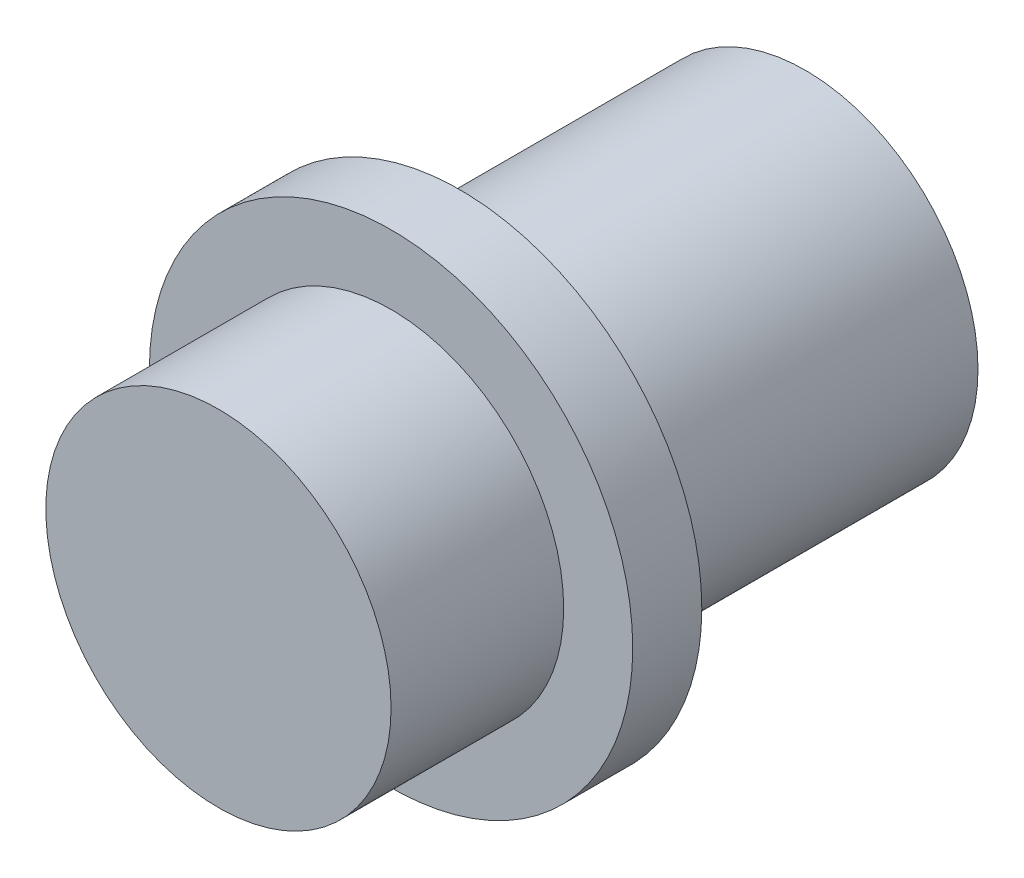
ISO-10303-21;
HEADER;
FILE_DESCRIPTION(('STEP AP214'),'2;1');
FILE_NAME('part.step','',(''),(''),'','','');
FILE_SCHEMA(('AUTOMOTIVE_DESIGN { 1 0 10303 214 1 1 1 1 }'));
ENDSEC;
DATA;
#1=APPLICATION_CONTEXT('core data for automotive mechanical design processes');
#2=APPLICATION_PROTOCOL_DEFINITION('international standard','automotive_design',2000,#1);
#3=PRODUCT_CONTEXT('',#1,'mechanical');
#4=PRODUCT('Part','Part','',(#3));
#5=PRODUCT_RELATED_PRODUCT_CATEGORY('part','',(#4));
#6=PRODUCT_DEFINITION_FORMATION('','',#4);
#7=PRODUCT_DEFINITION_CONTEXT('part definition',#1,'design');
#8=PRODUCT_DEFINITION('design','',#6,#7);
#9=PRODUCT_DEFINITION_SHAPE('','',#8);
#10=(LENGTH_UNIT() NAMED_UNIT(*) SI_UNIT(.MILLI.,.METRE.));
#11=(NAMED_UNIT(*) PLANE_ANGLE_UNIT() SI_UNIT($,.RADIAN.));
#12=(NAMED_UNIT(*) SI_UNIT($,.STERADIAN.) SOLID_ANGLE_UNIT());
#13=UNCERTAINTY_MEASURE_WITH_UNIT(LENGTH_MEASURE(1.E-05),#10,'distance_accuracy_value','');
#14=(GEOMETRIC_REPRESENTATION_CONTEXT(3) GLOBAL_UNCERTAINTY_ASSIGNED_CONTEXT((#13)) GLOBAL_UNIT_ASSIGNED_CONTEXT((#10,
#11,#12)) REPRESENTATION_CONTEXT('',''));
#15=CARTESIAN_POINT('',(0.,0.,0.));
#16=DIRECTION('',(0.,0.,1.));
#17=DIRECTION('',(1.,0.,0.));
#18=AXIS2_PLACEMENT_3D('',#15,#16,#17);
#19=CARTESIAN_POINT('',(0.,0.,10.));
#20=DIRECTION('',(0.,0.,-1.));
#21=DIRECTION('',(-1.,0.,0.));
#22=AXIS2_PLACEMENT_3D('',#19,#20,#21);
#23=CYLINDRICAL_SURFACE('',#22,5.);
#24=CARTESIAN_POINT('',(0.,0.,10.));
#25=DIRECTION('',(0.,0.,1.));
#26=DIRECTION('',(1.,0.,0.));
#27=AXIS2_PLACEMENT_3D('',#24,#25,#26);
#28=CIRCLE('',#27,5.);
#29=CARTESIAN_POINT('',(5.,0.,10.));
#30=VERTEX_POINT('',#29);
#31=EDGE_CURVE('E38',#30,#30,#28,.T.);
#32=ORIENTED_EDGE('',*,*,#31,.F.);
#33=EDGE_LOOP('',(#32));
#34=FACE_BOUND('',#33,.T.);
#35=CARTESIAN_POINT('',(0.,0.,0.));
#36=DIRECTION('',(0.,0.,1.));
#37=DIRECTION('',(1.,0.,0.));
#38=AXIS2_PLACEMENT_3D('',#35,#36,#37);
#39=CIRCLE('',#38,5.);
#40=CARTESIAN_POINT('',(5.,0.,0.));
#41=VERTEX_POINT('',#40);
#42=EDGE_CURVE('E34',#41,#41,#39,.T.);
#43=ORIENTED_EDGE('',*,*,#42,.T.);
#44=EDGE_LOOP('',(#43));
#45=FACE_BOUND('',#44,.T.);
#46=ADVANCED_FACE('F31',(#34,#45),#23,.T.);
#47=CARTESIAN_POINT('',(0.,0.,0.));
#48=DIRECTION('',(0.,0.,1.));
#49=DIRECTION('',(1.,0.,0.));
#50=AXIS2_PLACEMENT_3D('',#47,#48,#49);
#51=PLANE('',#50);
#52=ORIENTED_EDGE('',*,*,#42,.F.);
#53=EDGE_LOOP('',(#52));
#54=FACE_BOUND('',#53,.T.);
#55=ADVANCED_FACE('F72',(#54),#51,.F.);
#56=CARTESIAN_POINT('',(0.,0.,12.));
#57=DIRECTION('',(0.,0.,-1.));
#58=DIRECTION('',(-1.,0.,0.));
#59=AXIS2_PLACEMENT_3D('',#56,#57,#58);
#60=CYLINDRICAL_SURFACE('',#59,7.);
#61=CARTESIAN_POINT('',(0.,0.,12.));
#62=DIRECTION('',(0.,0.,1.));
#63=DIRECTION('',(1.,0.,0.));
#64=AXIS2_PLACEMENT_3D('',#61,#62,#63);
#65=CIRCLE('',#64,7.);
#66=CARTESIAN_POINT('',(7.,0.,12.));
#67=VERTEX_POINT('',#66);
#68=EDGE_CURVE('E46',#67,#67,#65,.T.);
#69=ORIENTED_EDGE('',*,*,#68,.F.);
#70=EDGE_LOOP('',(#69));
#71=FACE_BOUND('',#70,.T.);
#72=CARTESIAN_POINT('',(0.,0.,10.));
#73=DIRECTION('',(0.,0.,1.));
#74=DIRECTION('',(1.,0.,0.));
#75=AXIS2_PLACEMENT_3D('',#72,#73,#74);
#76=CIRCLE('',#75,7.);
#77=CARTESIAN_POINT('',(7.,0.,10.));
#78=VERTEX_POINT('',#77);
#79=EDGE_CURVE('E49',#78,#78,#76,.T.);
#80=ORIENTED_EDGE('',*,*,#79,.T.);
#81=EDGE_LOOP('',(#80));
#82=FACE_BOUND('',#81,.T.);
#83=ADVANCED_FACE('F77',(#71,#82),#60,.T.);
#84=CARTESIAN_POINT('',(0.,0.,12.));
#85=DIRECTION('',(0.,0.,1.));
#86=DIRECTION('',(1.,0.,0.));
#87=AXIS2_PLACEMENT_3D('',#84,#85,#86);
#88=PLANE('',#87);
#89=CARTESIAN_POINT('',(0.,0.,12.));
#90=DIRECTION('',(0.,0.,1.));
#91=DIRECTION('',(1.,0.,0.));
#92=AXIS2_PLACEMENT_3D('',#89,#90,#91);
#93=CIRCLE('',#92,5.);
#94=CARTESIAN_POINT('',(5.,0.,12.));
#95=VERTEX_POINT('',#94);
#96=EDGE_CURVE('E10',#95,#95,#93,.T.);
#97=ORIENTED_EDGE('',*,*,#96,.F.);
#98=EDGE_LOOP('',(#97));
#99=FACE_BOUND('',#98,.T.);
#100=ORIENTED_EDGE('',*,*,#68,.T.);
#101=EDGE_LOOP('',(#100));
#102=FACE_BOUND('',#101,.T.);
#103=ADVANCED_FACE('F67',(#99,#102),#88,.T.);
#104=CARTESIAN_POINT('',(0.,0.,10.));
#105=DIRECTION('',(0.,0.,1.));
#106=DIRECTION('',(1.,0.,0.));
#107=AXIS2_PLACEMENT_3D('',#104,#105,#106);
#108=PLANE('',#107);
#109=ORIENTED_EDGE('',*,*,#31,.T.);
#110=EDGE_LOOP('',(#109));
#111=FACE_BOUND('',#110,.T.);
#112=ORIENTED_EDGE('',*,*,#79,.F.);
#113=EDGE_LOOP('',(#112));
#114=FACE_BOUND('',#113,.T.);
#115=ADVANCED_FACE('F60',(#111,#114),#108,.F.);
#116=CARTESIAN_POINT('',(0.,0.,17.));
#117=DIRECTION('',(0.,0.,-1.));
#118=DIRECTION('',(-1.,0.,0.));
#119=AXIS2_PLACEMENT_3D('',#116,#117,#118);
#120=CYLINDRICAL_SURFACE('',#119,5.);
#121=CARTESIAN_POINT('',(0.,0.,17.));
#122=DIRECTION('',(0.,0.,1.));
#123=DIRECTION('',(1.,0.,0.));
#124=AXIS2_PLACEMENT_3D('',#121,#122,#123);
#125=CIRCLE('',#124,5.);
#126=CARTESIAN_POINT('',(5.,0.,17.));
#127=VERTEX_POINT('',#126);
#128=EDGE_CURVE('E45',#127,#127,#125,.T.);
#129=ORIENTED_EDGE('',*,*,#128,.F.);
#130=EDGE_LOOP('',(#129));
#131=FACE_BOUND('',#130,.T.);
#132=ORIENTED_EDGE('',*,*,#96,.T.);
#133=EDGE_LOOP('',(#132));
#134=FACE_BOUND('',#133,.T.);
#135=ADVANCED_FACE('F58',(#131,#134),#120,.T.);
#136=CARTESIAN_POINT('',(0.,0.,17.));
#137=DIRECTION('',(0.,0.,1.));
#138=DIRECTION('',(1.,0.,0.));
#139=AXIS2_PLACEMENT_3D('',#136,#137,#138);
#140=PLANE('',#139);
#141=ORIENTED_EDGE('',*,*,#128,.T.);
#142=EDGE_LOOP('',(#141));
#143=FACE_BOUND('',#142,.T.);
#144=ADVANCED_FACE('F56',(#143),#140,.T.);
#145=CLOSED_SHELL('',(#46,#55,#83,#103,#115,#135,#144));
#146=MANIFOLD_SOLID_BREP('B2',#145);
#147=ADVANCED_BREP_SHAPE_REPRESENTATION('',(#18,#146),#14);
#148=SHAPE_DEFINITION_REPRESENTATION(#9,#147);
ENDSEC;
END-ISO-10303-21;
